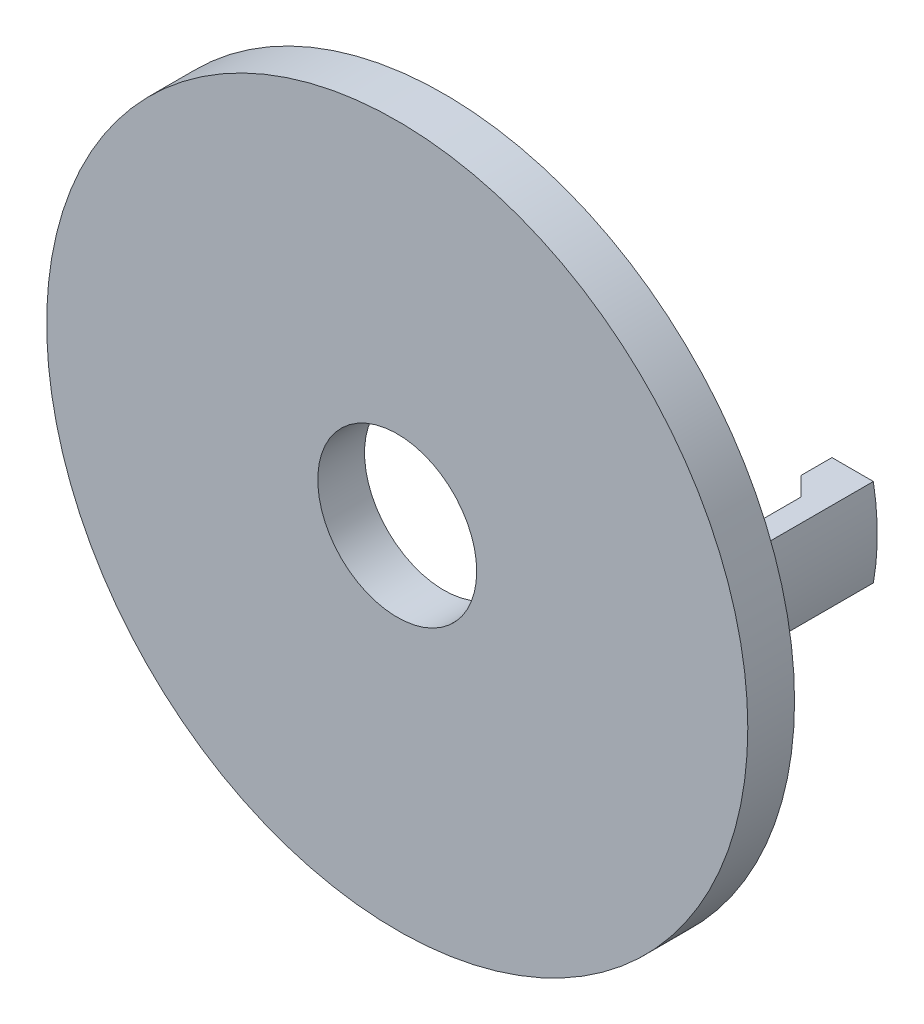
ISO-10303-21;
HEADER;
FILE_DESCRIPTION(('STEP AP214'),'2;1');
FILE_NAME('part.step','',(''),(''),'','','');
FILE_SCHEMA(('AUTOMOTIVE_DESIGN { 1 0 10303 214 1 1 1 1 }'));
ENDSEC;
DATA;
#1=APPLICATION_CONTEXT('core data for automotive mechanical design processes');
#2=APPLICATION_PROTOCOL_DEFINITION('international standard','automotive_design',2000,#1);
#3=PRODUCT_CONTEXT('',#1,'mechanical');
#4=PRODUCT('Part','Part','',(#3));
#5=PRODUCT_RELATED_PRODUCT_CATEGORY('part','',(#4));
#6=PRODUCT_DEFINITION_FORMATION('','',#4);
#7=PRODUCT_DEFINITION_CONTEXT('part definition',#1,'design');
#8=PRODUCT_DEFINITION('design','',#6,#7);
#9=PRODUCT_DEFINITION_SHAPE('','',#8);
#10=(LENGTH_UNIT() NAMED_UNIT(*) SI_UNIT(.MILLI.,.METRE.));
#11=(NAMED_UNIT(*) PLANE_ANGLE_UNIT() SI_UNIT($,.RADIAN.));
#12=(NAMED_UNIT(*) SI_UNIT($,.STERADIAN.) SOLID_ANGLE_UNIT());
#13=UNCERTAINTY_MEASURE_WITH_UNIT(LENGTH_MEASURE(1.E-05),#10,'distance_accuracy_value','');
#14=(GEOMETRIC_REPRESENTATION_CONTEXT(3) GLOBAL_UNCERTAINTY_ASSIGNED_CONTEXT((#13)) GLOBAL_UNIT_ASSIGNED_CONTEXT((#10,
#11,#12)) REPRESENTATION_CONTEXT('',''));
#15=CARTESIAN_POINT('',(0.,0.,0.));
#16=DIRECTION('',(0.,0.,1.));
#17=DIRECTION('',(1.,0.,0.));
#18=AXIS2_PLACEMENT_3D('',#15,#16,#17);
#19=CARTESIAN_POINT('',(21.65,-4.7,-19.85));
#20=DIRECTION('',(0.,0.,-1.));
#21=DIRECTION('',(-1.,0.,0.));
#22=AXIS2_PLACEMENT_3D('',#19,#20,#21);
#23=PLANE('',#22);
#24=DIRECTION('',(-1.,0.,0.));
#25=VECTOR('',#24,1.);
#26=CARTESIAN_POINT('',(21.65,4.7,-19.85));
#27=LINE('',#26,#25);
#28=CARTESIAN_POINT('',(26.0798773003249,4.7,-19.85));
#29=VERTEX_POINT('',#28);
#30=CARTESIAN_POINT('',(21.65,4.7,-19.85));
#31=VERTEX_POINT('',#30);
#32=EDGE_CURVE('E189',#29,#31,#27,.T.);
#33=ORIENTED_EDGE('',*,*,#32,.F.);
#34=CARTESIAN_POINT('',(0.,0.,-19.85));
#35=DIRECTION('',(0.,0.,1.));
#36=DIRECTION('',(1.,0.,0.));
#37=AXIS2_PLACEMENT_3D('',#34,#35,#36);
#38=CIRCLE('',#37,26.5);
#39=CARTESIAN_POINT('',(26.0798773003249,-4.7,-19.85));
#40=VERTEX_POINT('',#39);
#41=EDGE_CURVE('E48',#40,#29,#38,.T.);
#42=ORIENTED_EDGE('',*,*,#41,.F.);
#43=DIRECTION('',(-1.,0.,0.));
#44=VECTOR('',#43,1.);
#45=CARTESIAN_POINT('',(21.65,-4.7,-19.85));
#46=LINE('',#45,#44);
#47=CARTESIAN_POINT('',(21.65,-4.7,-19.85));
#48=VERTEX_POINT('',#47);
#49=EDGE_CURVE('E206',#40,#48,#46,.T.);
#50=ORIENTED_EDGE('',*,*,#49,.T.);
#51=DIRECTION('',(0.,1.,0.));
#52=VECTOR('',#51,1.);
#53=CARTESIAN_POINT('',(21.65,-4.7,-19.85));
#54=LINE('',#53,#52);
#55=EDGE_CURVE('E225',#48,#31,#54,.T.);
#56=ORIENTED_EDGE('',*,*,#55,.T.);
#57=EDGE_LOOP('',(#33,#42,#50,#56));
#58=FACE_BOUND('',#57,.T.);
#59=ADVANCED_FACE('F33',(#58),#23,.T.);
#60=CARTESIAN_POINT('',(0.,-4.7,0.));
#61=DIRECTION('',(0.,-1.,0.));
#62=DIRECTION('',(0.,0.,-1.));
#63=AXIS2_PLACEMENT_3D('',#60,#61,#62);
#64=PLANE('',#63);
#65=ORIENTED_EDGE('',*,*,#49,.F.);
#66=DIRECTION('',(0.,0.,1.));
#67=VECTOR('',#66,1.);
#68=CARTESIAN_POINT('',(26.0798773003249,-4.7,-19.85));
#69=LINE('',#68,#67);
#70=CARTESIAN_POINT('',(26.0798773003249,-4.7,0.));
#71=VERTEX_POINT('',#70);
#72=EDGE_CURVE('E301',#40,#71,#69,.T.);
#73=ORIENTED_EDGE('',*,*,#72,.T.);
#74=DIRECTION('',(1.,0.,0.));
#75=VECTOR('',#74,1.);
#76=CARTESIAN_POINT('',(26.5,-4.7,0.));
#77=LINE('',#76,#75);
#78=CARTESIAN_POINT('',(20.712132034356,-4.7,0.));
#79=VERTEX_POINT('',#78);
#80=EDGE_CURVE('E203',#79,#71,#77,.T.);
#81=ORIENTED_EDGE('',*,*,#80,.F.);
#82=DIRECTION('',(-0.707106781186548,0.,0.707106781186548));
#83=VECTOR('',#82,1.);
#84=CARTESIAN_POINT('',(23.65,-4.7,-2.93786796564401));
#85=LINE('',#84,#83);
#86=CARTESIAN_POINT('',(23.65,-4.7,-2.93786796564401));
#87=VERTEX_POINT('',#86);
#88=EDGE_CURVE('E200',#87,#79,#85,.T.);
#89=ORIENTED_EDGE('',*,*,#88,.F.);
#90=DIRECTION('',(0.,0.,1.));
#91=VECTOR('',#90,1.);
#92=CARTESIAN_POINT('',(23.65,-4.7,-14.5621320343561));
#93=LINE('',#92,#91);
#94=CARTESIAN_POINT('',(23.65,-4.7,-14.5621320343561));
#95=VERTEX_POINT('',#94);
#96=EDGE_CURVE('E214',#95,#87,#93,.T.);
#97=ORIENTED_EDGE('',*,*,#96,.F.);
#98=DIRECTION('',(0.707106781186565,0.,0.70710678118653));
#99=VECTOR('',#98,1.);
#100=CARTESIAN_POINT('',(23.65,-4.7,-14.5621320343561));
#101=LINE('',#100,#99);
#102=CARTESIAN_POINT('',(21.65,-4.7,-16.562132034356));
#103=VERTEX_POINT('',#102);
#104=EDGE_CURVE('E211',#103,#95,#101,.T.);
#105=ORIENTED_EDGE('',*,*,#104,.F.);
#106=DIRECTION('',(0.,0.,1.));
#107=VECTOR('',#106,1.);
#108=CARTESIAN_POINT('',(21.65,-4.7,-16.562132034356));
#109=LINE('',#108,#107);
#110=EDGE_CURVE('E208',#48,#103,#109,.T.);
#111=ORIENTED_EDGE('',*,*,#110,.F.);
#112=EDGE_LOOP('',(#65,#73,#81,#89,#97,#105,#111));
#113=FACE_BOUND('',#112,.T.);
#114=ADVANCED_FACE('F267',(#113),#64,.T.);
#115=CARTESIAN_POINT('',(0.,4.7,0.));
#116=DIRECTION('',(0.,-1.,0.));
#117=DIRECTION('',(0.,0.,-1.));
#118=AXIS2_PLACEMENT_3D('',#115,#116,#117);
#119=PLANE('',#118);
#120=DIRECTION('',(0.,0.,1.));
#121=VECTOR('',#120,1.);
#122=CARTESIAN_POINT('',(26.0798773003249,4.7,-19.85));
#123=LINE('',#122,#121);
#124=CARTESIAN_POINT('',(26.0798773003249,4.7,0.));
#125=VERTEX_POINT('',#124);
#126=EDGE_CURVE('E304',#29,#125,#123,.T.);
#127=ORIENTED_EDGE('',*,*,#126,.F.);
#128=ORIENTED_EDGE('',*,*,#32,.T.);
#129=DIRECTION('',(0.,0.,1.));
#130=VECTOR('',#129,1.);
#131=CARTESIAN_POINT('',(21.65,4.7,-16.562132034356));
#132=LINE('',#131,#130);
#133=CARTESIAN_POINT('',(21.65,4.7,-16.562132034356));
#134=VERTEX_POINT('',#133);
#135=EDGE_CURVE('E191',#31,#134,#132,.T.);
#136=ORIENTED_EDGE('',*,*,#135,.T.);
#137=DIRECTION('',(0.707106781186565,0.,0.70710678118653));
#138=VECTOR('',#137,1.);
#139=CARTESIAN_POINT('',(23.65,4.7,-14.5621320343561));
#140=LINE('',#139,#138);
#141=CARTESIAN_POINT('',(23.65,4.7,-14.5621320343561));
#142=VERTEX_POINT('',#141);
#143=EDGE_CURVE('E194',#134,#142,#140,.T.);
#144=ORIENTED_EDGE('',*,*,#143,.T.);
#145=DIRECTION('',(0.,0.,1.));
#146=VECTOR('',#145,1.);
#147=CARTESIAN_POINT('',(23.65,4.7,-14.5621320343561));
#148=LINE('',#147,#146);
#149=CARTESIAN_POINT('',(23.65,4.7,-2.93786796564401));
#150=VERTEX_POINT('',#149);
#151=EDGE_CURVE('E197',#142,#150,#148,.T.);
#152=ORIENTED_EDGE('',*,*,#151,.T.);
#153=DIRECTION('',(-0.707106781186548,0.,0.707106781186548));
#154=VECTOR('',#153,1.);
#155=CARTESIAN_POINT('',(23.65,4.7,-2.93786796564401));
#156=LINE('',#155,#154);
#157=CARTESIAN_POINT('',(20.712132034356,4.7,0.));
#158=VERTEX_POINT('',#157);
#159=EDGE_CURVE('E176',#150,#158,#156,.T.);
#160=ORIENTED_EDGE('',*,*,#159,.T.);
#161=DIRECTION('',(1.,0.,0.));
#162=VECTOR('',#161,1.);
#163=CARTESIAN_POINT('',(26.5,4.7,0.));
#164=LINE('',#163,#162);
#165=EDGE_CURVE('E186',#158,#125,#164,.T.);
#166=ORIENTED_EDGE('',*,*,#165,.T.);
#167=EDGE_LOOP('',(#127,#128,#136,#144,#152,#160,#166));
#168=FACE_BOUND('',#167,.T.);
#169=ADVANCED_FACE('F273',(#168),#119,.F.);
#170=CARTESIAN_POINT('',(-21.65,-4.7,-19.85));
#171=DIRECTION('',(0.,0.,1.));
#172=DIRECTION('',(1.,0.,0.));
#173=AXIS2_PLACEMENT_3D('',#170,#171,#172);
#174=PLANE('',#173);
#175=CARTESIAN_POINT('',(-26.0798773003249,4.7,-19.85));
#176=VERTEX_POINT('',#175);
#177=CARTESIAN_POINT('',(-26.0798773003249,-4.7,-19.85));
#178=VERTEX_POINT('',#177);
#179=EDGE_CURVE('E133',#176,#178,#38,.T.);
#180=ORIENTED_EDGE('',*,*,#179,.F.);
#181=DIRECTION('',(1.,0.,0.));
#182=VECTOR('',#181,1.);
#183=CARTESIAN_POINT('',(-21.65,4.7,-19.85));
#184=LINE('',#183,#182);
#185=CARTESIAN_POINT('',(-21.65,4.7,-19.85));
#186=VERTEX_POINT('',#185);
#187=EDGE_CURVE('E143',#176,#186,#184,.T.);
#188=ORIENTED_EDGE('',*,*,#187,.T.);
#189=DIRECTION('',(0.,1.,0.));
#190=VECTOR('',#189,1.);
#191=CARTESIAN_POINT('',(-21.65,-4.7,-19.85));
#192=LINE('',#191,#190);
#193=CARTESIAN_POINT('',(-21.65,-4.7,-19.85));
#194=VERTEX_POINT('',#193);
#195=EDGE_CURVE('E177',#194,#186,#192,.T.);
#196=ORIENTED_EDGE('',*,*,#195,.F.);
#197=DIRECTION('',(1.,0.,0.));
#198=VECTOR('',#197,1.);
#199=CARTESIAN_POINT('',(-21.65,-4.7,-19.85));
#200=LINE('',#199,#198);
#201=EDGE_CURVE('E145',#178,#194,#200,.T.);
#202=ORIENTED_EDGE('',*,*,#201,.F.);
#203=EDGE_LOOP('',(#180,#188,#196,#202));
#204=FACE_BOUND('',#203,.T.);
#205=ADVANCED_FACE('F141',(#204),#174,.F.);
#206=CARTESIAN_POINT('',(0.,-4.7,0.));
#207=DIRECTION('',(0.,-1.,0.));
#208=DIRECTION('',(0.,0.,-1.));
#209=AXIS2_PLACEMENT_3D('',#206,#207,#208);
#210=PLANE('',#209);
#211=DIRECTION('',(-1.,0.,0.));
#212=VECTOR('',#211,1.);
#213=CARTESIAN_POINT('',(-26.5,-4.7,0.));
#214=LINE('',#213,#212);
#215=CARTESIAN_POINT('',(-20.712132034356,-4.7,0.));
#216=VERTEX_POINT('',#215);
#217=CARTESIAN_POINT('',(-26.0798773003249,-4.7,0.));
#218=VERTEX_POINT('',#217);
#219=EDGE_CURVE('E170',#216,#218,#214,.T.);
#220=ORIENTED_EDGE('',*,*,#219,.T.);
#221=DIRECTION('',(0.,0.,1.));
#222=VECTOR('',#221,1.);
#223=CARTESIAN_POINT('',(-26.0798773003249,-4.7,-19.85));
#224=LINE('',#223,#222);
#225=EDGE_CURVE('E146',#218,#178,#224,.F.);
#226=ORIENTED_EDGE('',*,*,#225,.T.);
#227=ORIENTED_EDGE('',*,*,#201,.T.);
#228=DIRECTION('',(0.,0.,1.));
#229=VECTOR('',#228,1.);
#230=CARTESIAN_POINT('',(-21.65,-4.7,-16.562132034356));
#231=LINE('',#230,#229);
#232=CARTESIAN_POINT('',(-21.65,-4.7,-16.562132034356));
#233=VERTEX_POINT('',#232);
#234=EDGE_CURVE('E167',#194,#233,#231,.T.);
#235=ORIENTED_EDGE('',*,*,#234,.T.);
#236=DIRECTION('',(-0.707106781186565,0.,0.70710678118653));
#237=VECTOR('',#236,1.);
#238=CARTESIAN_POINT('',(-23.65,-4.7,-14.5621320343561));
#239=LINE('',#238,#237);
#240=CARTESIAN_POINT('',(-23.65,-4.7,-14.5621320343561));
#241=VERTEX_POINT('',#240);
#242=EDGE_CURVE('E165',#233,#241,#239,.T.);
#243=ORIENTED_EDGE('',*,*,#242,.T.);
#244=DIRECTION('',(0.,0.,1.));
#245=VECTOR('',#244,1.);
#246=CARTESIAN_POINT('',(-23.65,-4.7,-14.5621320343561));
#247=LINE('',#246,#245);
#248=CARTESIAN_POINT('',(-23.65,-4.7,-2.93786796564401));
#249=VERTEX_POINT('',#248);
#250=EDGE_CURVE('E163',#241,#249,#247,.T.);
#251=ORIENTED_EDGE('',*,*,#250,.T.);
#252=DIRECTION('',(0.707106781186548,0.,0.707106781186548));
#253=VECTOR('',#252,1.);
#254=CARTESIAN_POINT('',(-23.65,-4.7,-2.93786796564401));
#255=LINE('',#254,#253);
#256=EDGE_CURVE('E155',#249,#216,#255,.T.);
#257=ORIENTED_EDGE('',*,*,#256,.T.);
#258=EDGE_LOOP('',(#220,#226,#227,#235,#243,#251,#257));
#259=FACE_BOUND('',#258,.T.);
#260=ADVANCED_FACE('F264',(#259),#210,.T.);
#261=CARTESIAN_POINT('',(0.,4.7,0.));
#262=DIRECTION('',(0.,-1.,0.));
#263=DIRECTION('',(0.,0.,-1.));
#264=AXIS2_PLACEMENT_3D('',#261,#262,#263);
#265=PLANE('',#264);
#266=DIRECTION('',(0.,0.,1.));
#267=VECTOR('',#266,1.);
#268=CARTESIAN_POINT('',(-26.0798773003249,4.7,-19.85));
#269=LINE('',#268,#267);
#270=CARTESIAN_POINT('',(-26.0798773003249,4.7,0.));
#271=VERTEX_POINT('',#270);
#272=EDGE_CURVE('E11',#271,#176,#269,.F.);
#273=ORIENTED_EDGE('',*,*,#272,.F.);
#274=DIRECTION('',(-1.,0.,0.));
#275=VECTOR('',#274,1.);
#276=CARTESIAN_POINT('',(-26.5,4.7,0.));
#277=LINE('',#276,#275);
#278=CARTESIAN_POINT('',(-20.712132034356,4.7,0.));
#279=VERTEX_POINT('',#278);
#280=EDGE_CURVE('E153',#279,#271,#277,.T.);
#281=ORIENTED_EDGE('',*,*,#280,.F.);
#282=DIRECTION('',(0.707106781186548,0.,0.707106781186548));
#283=VECTOR('',#282,1.);
#284=CARTESIAN_POINT('',(-23.65,4.7,-2.93786796564401));
#285=LINE('',#284,#283);
#286=CARTESIAN_POINT('',(-23.65,4.7,-2.93786796564401));
#287=VERTEX_POINT('',#286);
#288=EDGE_CURVE('E307',#287,#279,#285,.T.);
#289=ORIENTED_EDGE('',*,*,#288,.F.);
#290=DIRECTION('',(0.,0.,1.));
#291=VECTOR('',#290,1.);
#292=CARTESIAN_POINT('',(-23.65,4.7,-14.5621320343561));
#293=LINE('',#292,#291);
#294=CARTESIAN_POINT('',(-23.65,4.7,-14.5621320343561));
#295=VERTEX_POINT('',#294);
#296=EDGE_CURVE('E313',#295,#287,#293,.T.);
#297=ORIENTED_EDGE('',*,*,#296,.F.);
#298=DIRECTION('',(-0.707106781186565,0.,0.70710678118653));
#299=VECTOR('',#298,1.);
#300=CARTESIAN_POINT('',(-23.65,4.7,-14.5621320343561));
#301=LINE('',#300,#299);
#302=CARTESIAN_POINT('',(-21.65,4.7,-16.562132034356));
#303=VERTEX_POINT('',#302);
#304=EDGE_CURVE('E157',#303,#295,#301,.T.);
#305=ORIENTED_EDGE('',*,*,#304,.F.);
#306=DIRECTION('',(0.,0.,1.));
#307=VECTOR('',#306,1.);
#308=CARTESIAN_POINT('',(-21.65,4.7,-16.562132034356));
#309=LINE('',#308,#307);
#310=EDGE_CURVE('E152',#186,#303,#309,.T.);
#311=ORIENTED_EDGE('',*,*,#310,.F.);
#312=ORIENTED_EDGE('',*,*,#187,.F.);
#313=EDGE_LOOP('',(#273,#281,#289,#297,#305,#311,#312));
#314=FACE_BOUND('',#313,.T.);
#315=ADVANCED_FACE('F149',(#314),#265,.F.);
#316=CARTESIAN_POINT('',(0.,0.,5.));
#317=DIRECTION('',(0.,0.,-1.));
#318=DIRECTION('',(-1.,0.,0.));
#319=AXIS2_PLACEMENT_3D('',#316,#317,#318);
#320=CYLINDRICAL_SURFACE('',#319,37.5);
#321=CARTESIAN_POINT('',(0.,0.,5.));
#322=DIRECTION('',(0.,0.,1.));
#323=DIRECTION('',(1.,0.,0.));
#324=AXIS2_PLACEMENT_3D('',#321,#322,#323);
#325=CIRCLE('',#324,37.5);
#326=CARTESIAN_POINT('',(37.5,0.,5.));
#327=VERTEX_POINT('',#326);
#328=EDGE_CURVE('E41',#327,#327,#325,.T.);
#329=ORIENTED_EDGE('',*,*,#328,.F.);
#330=EDGE_LOOP('',(#329));
#331=FACE_BOUND('',#330,.T.);
#332=CARTESIAN_POINT('',(0.,0.,0.));
#333=DIRECTION('',(0.,0.,1.));
#334=DIRECTION('',(1.,0.,0.));
#335=AXIS2_PLACEMENT_3D('',#332,#333,#334);
#336=CIRCLE('',#335,37.5);
#337=CARTESIAN_POINT('',(37.5,0.,0.));
#338=VERTEX_POINT('',#337);
#339=EDGE_CURVE('E233',#338,#338,#336,.T.);
#340=ORIENTED_EDGE('',*,*,#339,.T.);
#341=EDGE_LOOP('',(#340));
#342=FACE_BOUND('',#341,.T.);
#343=ADVANCED_FACE('F35',(#331,#342),#320,.T.);
#344=CARTESIAN_POINT('',(0.,0.,5.));
#345=DIRECTION('',(0.,0.,1.));
#346=DIRECTION('',(1.,0.,0.));
#347=AXIS2_PLACEMENT_3D('',#344,#345,#346);
#348=PLANE('',#347);
#349=CARTESIAN_POINT('',(0.,0.,5.));
#350=DIRECTION('',(0.,0.,1.));
#351=DIRECTION('',(1.,0.,0.));
#352=AXIS2_PLACEMENT_3D('',#349,#350,#351);
#353=CIRCLE('',#352,8.5);
#354=CARTESIAN_POINT('',(8.5,0.,5.));
#355=VERTEX_POINT('',#354);
#356=EDGE_CURVE('E220',#355,#355,#353,.T.);
#357=ORIENTED_EDGE('',*,*,#356,.F.);
#358=EDGE_LOOP('',(#357));
#359=FACE_BOUND('',#358,.T.);
#360=ORIENTED_EDGE('',*,*,#328,.T.);
#361=EDGE_LOOP('',(#360));
#362=FACE_BOUND('',#361,.T.);
#363=ADVANCED_FACE('F245',(#359,#362),#348,.T.);
#364=CARTESIAN_POINT('',(0.,0.,0.));
#365=DIRECTION('',(0.,0.,1.));
#366=DIRECTION('',(1.,0.,0.));
#367=AXIS2_PLACEMENT_3D('',#364,#365,#366);
#368=PLANE('',#367);
#369=ORIENTED_EDGE('',*,*,#280,.T.);
#370=CARTESIAN_POINT('',(0.,0.,0.));
#371=DIRECTION('',(0.,0.,1.));
#372=DIRECTION('',(1.,0.,0.));
#373=AXIS2_PLACEMENT_3D('',#370,#371,#372);
#374=CIRCLE('',#373,26.5);
#375=EDGE_CURVE('E55',#271,#218,#374,.T.);
#376=ORIENTED_EDGE('',*,*,#375,.T.);
#377=ORIENTED_EDGE('',*,*,#219,.F.);
#378=DIRECTION('',(0.,1.,0.));
#379=VECTOR('',#378,1.);
#380=CARTESIAN_POINT('',(-20.712132034356,-4.7,0.));
#381=LINE('',#380,#379);
#382=EDGE_CURVE('E174',#216,#279,#381,.T.);
#383=ORIENTED_EDGE('',*,*,#382,.T.);
#384=EDGE_LOOP('',(#369,#376,#377,#383));
#385=FACE_BOUND('',#384,.T.);
#386=EDGE_CURVE('E302',#71,#125,#374,.T.);
#387=ORIENTED_EDGE('',*,*,#386,.T.);
#388=ORIENTED_EDGE('',*,*,#165,.F.);
#389=DIRECTION('',(0.,1.,0.));
#390=VECTOR('',#389,1.);
#391=CARTESIAN_POINT('',(20.712132034356,-4.7,0.));
#392=LINE('',#391,#390);
#393=EDGE_CURVE('E217',#79,#158,#392,.T.);
#394=ORIENTED_EDGE('',*,*,#393,.F.);
#395=ORIENTED_EDGE('',*,*,#80,.T.);
#396=EDGE_LOOP('',(#387,#388,#394,#395));
#397=FACE_BOUND('',#396,.T.);
#398=ORIENTED_EDGE('',*,*,#339,.F.);
#399=EDGE_LOOP('',(#398));
#400=FACE_BOUND('',#399,.T.);
#401=CARTESIAN_POINT('',(0.,0.,0.));
#402=DIRECTION('',(0.,0.,1.));
#403=DIRECTION('',(1.,0.,0.));
#404=AXIS2_PLACEMENT_3D('',#401,#402,#403);
#405=CIRCLE('',#404,8.5);
#406=CARTESIAN_POINT('',(8.5,0.,0.));
#407=VERTEX_POINT('',#406);
#408=EDGE_CURVE('E230',#407,#407,#405,.T.);
#409=ORIENTED_EDGE('',*,*,#408,.T.);
#410=EDGE_LOOP('',(#409));
#411=FACE_BOUND('',#410,.T.);
#412=ADVANCED_FACE('F241',(#385,#397,#400,#411),#368,.F.);
#413=CARTESIAN_POINT('',(0.,0.,0.));
#414=DIRECTION('',(0.,0.,1.));
#415=DIRECTION('',(1.,0.,0.));
#416=AXIS2_PLACEMENT_3D('',#413,#414,#415);
#417=CYLINDRICAL_SURFACE('',#416,8.5);
#418=ORIENTED_EDGE('',*,*,#408,.F.);
#419=EDGE_LOOP('',(#418));
#420=FACE_BOUND('',#419,.T.);
#421=ORIENTED_EDGE('',*,*,#356,.T.);
#422=EDGE_LOOP('',(#421));
#423=FACE_BOUND('',#422,.T.);
#424=ADVANCED_FACE('F244',(#420,#423),#417,.F.);
#425=CARTESIAN_POINT('',(23.65,-4.7,-2.93786796564401));
#426=DIRECTION('',(-0.707106781186547,0.,-0.707106781186548));
#427=DIRECTION('',(-0.707106781186548,0.,0.707106781186547));
#428=AXIS2_PLACEMENT_3D('',#425,#426,#427);
#429=PLANE('',#428);
#430=ORIENTED_EDGE('',*,*,#393,.T.);
#431=ORIENTED_EDGE('',*,*,#159,.F.);
#432=DIRECTION('',(0.,1.,0.));
#433=VECTOR('',#432,1.);
#434=CARTESIAN_POINT('',(23.65,-4.7,-2.93786796564401));
#435=LINE('',#434,#433);
#436=EDGE_CURVE('E218',#87,#150,#435,.T.);
#437=ORIENTED_EDGE('',*,*,#436,.F.);
#438=ORIENTED_EDGE('',*,*,#88,.T.);
#439=EDGE_LOOP('',(#430,#431,#437,#438));
#440=FACE_BOUND('',#439,.T.);
#441=ADVANCED_FACE('F251',(#440),#429,.T.);
#442=CARTESIAN_POINT('',(23.65,-4.7,-14.5621320343561));
#443=DIRECTION('',(-1.,0.,0.));
#444=DIRECTION('',(0.,0.,1.));
#445=AXIS2_PLACEMENT_3D('',#442,#443,#444);
#446=PLANE('',#445);
#447=ORIENTED_EDGE('',*,*,#436,.T.);
#448=ORIENTED_EDGE('',*,*,#151,.F.);
#449=DIRECTION('',(0.,1.,0.));
#450=VECTOR('',#449,1.);
#451=CARTESIAN_POINT('',(23.65,-4.7,-14.5621320343561));
#452=LINE('',#451,#450);
#453=EDGE_CURVE('E221',#95,#142,#452,.T.);
#454=ORIENTED_EDGE('',*,*,#453,.F.);
#455=ORIENTED_EDGE('',*,*,#96,.T.);
#456=EDGE_LOOP('',(#447,#448,#454,#455));
#457=FACE_BOUND('',#456,.T.);
#458=ADVANCED_FACE('F282',(#457),#446,.T.);
#459=CARTESIAN_POINT('',(23.65,-4.7,-14.5621320343561));
#460=DIRECTION('',(-0.70710678118653,0.,0.707106781186565));
#461=DIRECTION('',(0.707106781186565,0.,0.70710678118653));
#462=AXIS2_PLACEMENT_3D('',#459,#460,#461);
#463=PLANE('',#462);
#464=ORIENTED_EDGE('',*,*,#453,.T.);
#465=ORIENTED_EDGE('',*,*,#143,.F.);
#466=DIRECTION('',(0.,1.,0.));
#467=VECTOR('',#466,1.);
#468=CARTESIAN_POINT('',(21.65,-4.7,-16.562132034356));
#469=LINE('',#468,#467);
#470=EDGE_CURVE('E223',#103,#134,#469,.T.);
#471=ORIENTED_EDGE('',*,*,#470,.F.);
#472=ORIENTED_EDGE('',*,*,#104,.T.);
#473=EDGE_LOOP('',(#464,#465,#471,#472));
#474=FACE_BOUND('',#473,.T.);
#475=ADVANCED_FACE('F287',(#474),#463,.T.);
#476=CARTESIAN_POINT('',(21.65,-4.7,-16.562132034356));
#477=DIRECTION('',(-1.,0.,0.));
#478=DIRECTION('',(0.,0.,1.));
#479=AXIS2_PLACEMENT_3D('',#476,#477,#478);
#480=PLANE('',#479);
#481=ORIENTED_EDGE('',*,*,#470,.T.);
#482=ORIENTED_EDGE('',*,*,#135,.F.);
#483=ORIENTED_EDGE('',*,*,#55,.F.);
#484=ORIENTED_EDGE('',*,*,#110,.T.);
#485=EDGE_LOOP('',(#481,#482,#483,#484));
#486=FACE_BOUND('',#485,.T.);
#487=ADVANCED_FACE('F279',(#486),#480,.T.);
#488=CARTESIAN_POINT('',(-23.65,-4.7,-2.93786796564401));
#489=DIRECTION('',(-0.707106781186547,0.,0.707106781186548));
#490=DIRECTION('',(0.707106781186548,0.,0.707106781186547));
#491=AXIS2_PLACEMENT_3D('',#488,#489,#490);
#492=PLANE('',#491);
#493=DIRECTION('',(0.,1.,0.));
#494=VECTOR('',#493,1.);
#495=CARTESIAN_POINT('',(-23.65,-4.7,-2.93786796564401));
#496=LINE('',#495,#494);
#497=EDGE_CURVE('E173',#249,#287,#496,.T.);
#498=ORIENTED_EDGE('',*,*,#497,.T.);
#499=ORIENTED_EDGE('',*,*,#288,.T.);
#500=ORIENTED_EDGE('',*,*,#382,.F.);
#501=ORIENTED_EDGE('',*,*,#256,.F.);
#502=EDGE_LOOP('',(#498,#499,#500,#501));
#503=FACE_BOUND('',#502,.T.);
#504=ADVANCED_FACE('F334',(#503),#492,.F.);
#505=CARTESIAN_POINT('',(-21.65,-4.7,-16.562132034356));
#506=DIRECTION('',(-1.,0.,0.));
#507=DIRECTION('',(0.,0.,1.));
#508=AXIS2_PLACEMENT_3D('',#505,#506,#507);
#509=PLANE('',#508);
#510=ORIENTED_EDGE('',*,*,#195,.T.);
#511=ORIENTED_EDGE('',*,*,#310,.T.);
#512=DIRECTION('',(0.,1.,0.));
#513=VECTOR('',#512,1.);
#514=CARTESIAN_POINT('',(-21.65,-4.7,-16.562132034356));
#515=LINE('',#514,#513);
#516=EDGE_CURVE('E179',#233,#303,#515,.T.);
#517=ORIENTED_EDGE('',*,*,#516,.F.);
#518=ORIENTED_EDGE('',*,*,#234,.F.);
#519=EDGE_LOOP('',(#510,#511,#517,#518));
#520=FACE_BOUND('',#519,.T.);
#521=ADVANCED_FACE('F325',(#520),#509,.F.);
#522=CARTESIAN_POINT('',(-23.65,-4.7,-14.5621320343561));
#523=DIRECTION('',(-0.70710678118653,0.,-0.707106781186565));
#524=DIRECTION('',(-0.707106781186565,0.,0.70710678118653));
#525=AXIS2_PLACEMENT_3D('',#522,#523,#524);
#526=PLANE('',#525);
#527=ORIENTED_EDGE('',*,*,#516,.T.);
#528=ORIENTED_EDGE('',*,*,#304,.T.);
#529=DIRECTION('',(0.,1.,0.));
#530=VECTOR('',#529,1.);
#531=CARTESIAN_POINT('',(-23.65,-4.7,-14.5621320343561));
#532=LINE('',#531,#530);
#533=EDGE_CURVE('E181',#241,#295,#532,.T.);
#534=ORIENTED_EDGE('',*,*,#533,.F.);
#535=ORIENTED_EDGE('',*,*,#242,.F.);
#536=EDGE_LOOP('',(#527,#528,#534,#535));
#537=FACE_BOUND('',#536,.T.);
#538=ADVANCED_FACE('F318',(#537),#526,.F.);
#539=CARTESIAN_POINT('',(-23.65,-4.7,-14.5621320343561));
#540=DIRECTION('',(-1.,0.,0.));
#541=DIRECTION('',(0.,0.,1.));
#542=AXIS2_PLACEMENT_3D('',#539,#540,#541);
#543=PLANE('',#542);
#544=ORIENTED_EDGE('',*,*,#533,.T.);
#545=ORIENTED_EDGE('',*,*,#296,.T.);
#546=ORIENTED_EDGE('',*,*,#497,.F.);
#547=ORIENTED_EDGE('',*,*,#250,.F.);
#548=EDGE_LOOP('',(#544,#545,#546,#547));
#549=FACE_BOUND('',#548,.T.);
#550=ADVANCED_FACE('F333',(#549),#543,.F.);
#551=CARTESIAN_POINT('',(0.,0.,-19.85));
#552=DIRECTION('',(0.,0.,1.));
#553=DIRECTION('',(1.,0.,0.));
#554=AXIS2_PLACEMENT_3D('',#551,#552,#553);
#555=CYLINDRICAL_SURFACE('',#554,26.5);
#556=ORIENTED_EDGE('',*,*,#179,.T.);
#557=ORIENTED_EDGE('',*,*,#225,.F.);
#558=ORIENTED_EDGE('',*,*,#375,.F.);
#559=ORIENTED_EDGE('',*,*,#272,.T.);
#560=EDGE_LOOP('',(#556,#557,#558,#559));
#561=FACE_BOUND('',#560,.T.);
#562=ADVANCED_FACE('F132',(#561),#555,.T.);
#563=ORIENTED_EDGE('',*,*,#41,.T.);
#564=ORIENTED_EDGE('',*,*,#126,.T.);
#565=ORIENTED_EDGE('',*,*,#386,.F.);
#566=ORIENTED_EDGE('',*,*,#72,.F.);
#567=EDGE_LOOP('',(#563,#564,#565,#566));
#568=FACE_BOUND('',#567,.T.);
#569=ADVANCED_FACE('F305',(#568),#555,.T.);
#570=CLOSED_SHELL('',(#59,#114,#169,#205,#260,#315,#343,#363,#412,#424,#441,#458,#475,#487,#504,
#521,#538,#550,#562,#569));
#571=MANIFOLD_SOLID_BREP('B2',#570);
#572=ADVANCED_BREP_SHAPE_REPRESENTATION('',(#18,#571),#14);
#573=SHAPE_DEFINITION_REPRESENTATION(#9,#572);
ENDSEC;
END-ISO-10303-21;
